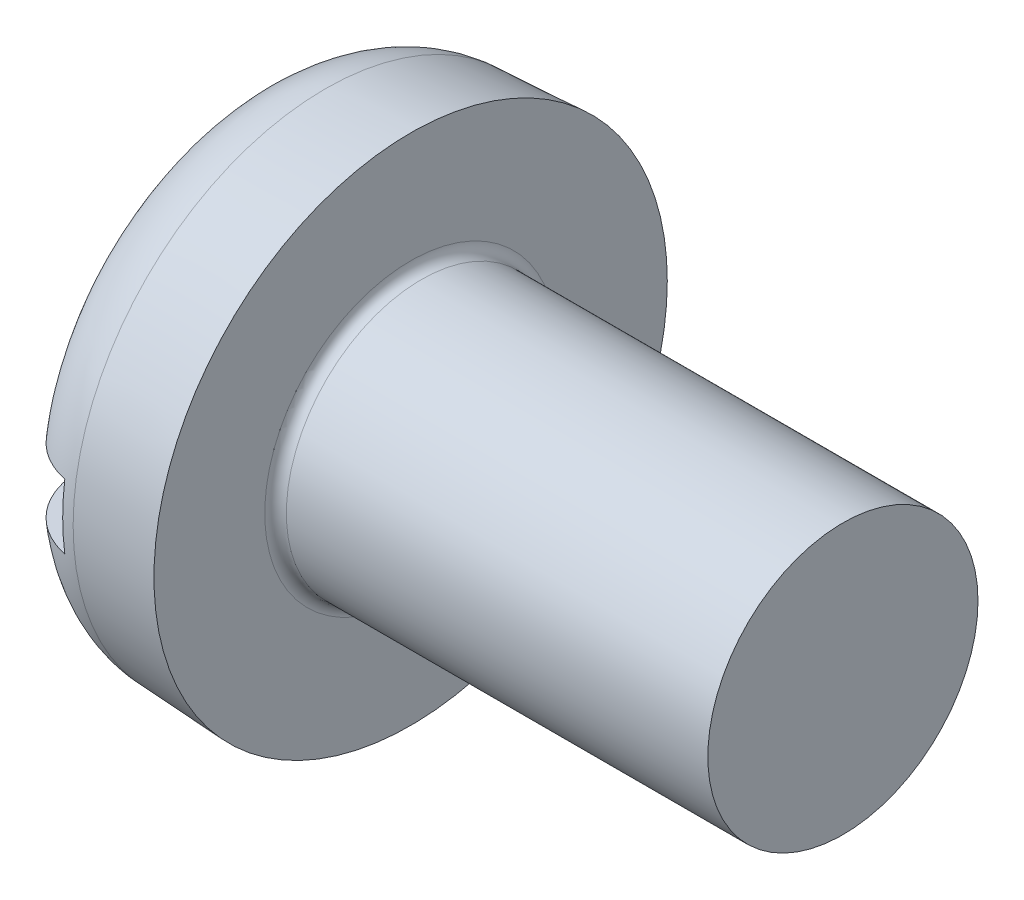
ISO-10303-21;
HEADER;
FILE_DESCRIPTION(('STEP AP214'),'2;1');
FILE_NAME('part.step','',(''),(''),'','','');
FILE_SCHEMA(('AUTOMOTIVE_DESIGN { 1 0 10303 214 1 1 1 1 }'));
ENDSEC;
DATA;
#1=APPLICATION_CONTEXT('core data for automotive mechanical design processes');
#2=APPLICATION_PROTOCOL_DEFINITION('international standard','automotive_design',2000,#1);
#3=PRODUCT_CONTEXT('',#1,'mechanical');
#4=PRODUCT('Part','Part','',(#3));
#5=PRODUCT_RELATED_PRODUCT_CATEGORY('part','',(#4));
#6=PRODUCT_DEFINITION_FORMATION('','',#4);
#7=PRODUCT_DEFINITION_CONTEXT('part definition',#1,'design');
#8=PRODUCT_DEFINITION('design','',#6,#7);
#9=PRODUCT_DEFINITION_SHAPE('','',#8);
#10=(LENGTH_UNIT() NAMED_UNIT(*) SI_UNIT(.MILLI.,.METRE.));
#11=(NAMED_UNIT(*) PLANE_ANGLE_UNIT() SI_UNIT($,.RADIAN.));
#12=(NAMED_UNIT(*) SI_UNIT($,.STERADIAN.) SOLID_ANGLE_UNIT());
#13=UNCERTAINTY_MEASURE_WITH_UNIT(LENGTH_MEASURE(1.E-05),#10,'distance_accuracy_value','');
#14=(GEOMETRIC_REPRESENTATION_CONTEXT(3) GLOBAL_UNCERTAINTY_ASSIGNED_CONTEXT((#13)) GLOBAL_UNIT_ASSIGNED_CONTEXT((#10,
#11,#12)) REPRESENTATION_CONTEXT('',''));
#15=CARTESIAN_POINT('',(0.,0.,0.));
#16=DIRECTION('',(0.,0.,1.));
#17=DIRECTION('',(1.,0.,0.));
#18=AXIS2_PLACEMENT_3D('',#15,#16,#17);
#19=CARTESIAN_POINT('',(0.,0.,0.));
#20=DIRECTION('',(1.,0.,0.));
#21=DIRECTION('',(0.,0.,-1.));
#22=AXIS2_PLACEMENT_3D('',#19,#20,#21);
#23=PLANE('',#22);
#24=CARTESIAN_POINT('',(0.,0.,0.));
#25=DIRECTION('',(1.,0.,0.));
#26=DIRECTION('',(0.,0.,-1.));
#27=AXIS2_PLACEMENT_3D('',#24,#25,#26);
#28=CIRCLE('',#27,0.792332453019639);
#29=CARTESIAN_POINT('',(0.,0.15,0.778004316252885));
#30=VERTEX_POINT('',#29);
#31=CARTESIAN_POINT('',(0.,0.15,-0.778004316252885));
#32=VERTEX_POINT('',#31);
#33=EDGE_CURVE('E100',#30,#32,#28,.F.);
#34=ORIENTED_EDGE('',*,*,#33,.T.);
#35=DIRECTION('',(0.,0.,1.));
#36=VECTOR('',#35,1.);
#37=CARTESIAN_POINT('',(0.,0.15,-1.1875));
#38=LINE('',#37,#36);
#39=EDGE_CURVE('E94',#32,#30,#38,.T.);
#40=ORIENTED_EDGE('',*,*,#39,.T.);
#41=EDGE_LOOP('',(#34,#40));
#42=FACE_BOUND('',#41,.T.);
#43=ADVANCED_FACE('F39',(#42),#23,.F.);
#44=CARTESIAN_POINT('',(0.75,0.,0.));
#45=DIRECTION('',(1.,0.,0.));
#46=DIRECTION('',(0.,0.,-1.));
#47=AXIS2_PLACEMENT_3D('',#44,#45,#46);
#48=PLANE('',#47);
#49=CARTESIAN_POINT('',(0.75,0.,0.));
#50=DIRECTION('',(1.,0.,0.));
#51=DIRECTION('',(0.,0.,-1.));
#52=AXIS2_PLACEMENT_3D('',#49,#50,#51);
#53=CIRCLE('',#52,0.675);
#54=CARTESIAN_POINT('',(0.75,0.,-0.675));
#55=VERTEX_POINT('',#54);
#56=EDGE_CURVE('E11',#55,#55,#53,.F.);
#57=ORIENTED_EDGE('',*,*,#56,.T.);
#58=EDGE_LOOP('',(#57));
#59=FACE_BOUND('',#58,.T.);
#60=CARTESIAN_POINT('',(0.75,0.,0.));
#61=DIRECTION('',(1.,0.,0.));
#62=DIRECTION('',(0.,0.,-1.));
#63=AXIS2_PLACEMENT_3D('',#60,#61,#62);
#64=CIRCLE('',#63,1.1875);
#65=CARTESIAN_POINT('',(0.75,0.,-1.1875));
#66=VERTEX_POINT('',#65);
#67=EDGE_CURVE('E171',#66,#66,#64,.T.);
#68=ORIENTED_EDGE('',*,*,#67,.T.);
#69=EDGE_LOOP('',(#68));
#70=FACE_BOUND('',#69,.T.);
#71=ADVANCED_FACE('F147',(#59,#70),#48,.T.);
#72=CARTESIAN_POINT('',(0.75,0.,0.));
#73=DIRECTION('',(1.,0.,0.));
#74=DIRECTION('',(0.,0.,-1.));
#75=AXIS2_PLACEMENT_3D('',#72,#73,#74);
#76=CONICAL_SURFACE('',#75,1.1875,0.05235987755983);
#77=CARTESIAN_POINT('',(0.355374016408896,0.,0.));
#78=DIRECTION('',(1.,0.,0.));
#79=DIRECTION('',(0.,0.,-1.));
#80=AXIS2_PLACEMENT_3D('',#77,#78,#79);
#81=CIRCLE('',#80,1.1668185285526);
#82=CARTESIAN_POINT('',(0.355374016408896,0.,-1.1668185285526));
#83=VERTEX_POINT('',#82);
#84=EDGE_CURVE('E104',#83,#83,#81,.T.);
#85=ORIENTED_EDGE('',*,*,#84,.T.);
#86=EDGE_LOOP('',(#85));
#87=FACE_BOUND('',#86,.T.);
#88=ORIENTED_EDGE('',*,*,#67,.F.);
#89=EDGE_LOOP('',(#88));
#90=FACE_BOUND('',#89,.T.);
#91=ADVANCED_FACE('F153',(#87,#90),#76,.T.);
#92=CARTESIAN_POINT('',(0.,-0.15,-0.778004316252885));
#93=VERTEX_POINT('',#92);
#94=CARTESIAN_POINT('',(0.,-0.15,0.778004316252885));
#95=VERTEX_POINT('',#94);
#96=EDGE_CURVE('E93',#93,#95,#28,.F.);
#97=ORIENTED_EDGE('',*,*,#96,.T.);
#98=DIRECTION('',(0.,0.,1.));
#99=VECTOR('',#98,1.);
#100=CARTESIAN_POINT('',(0.,-0.15,-1.1875));
#101=LINE('',#100,#99);
#102=EDGE_CURVE('E54',#93,#95,#101,.T.);
#103=ORIENTED_EDGE('',*,*,#102,.F.);
#104=EDGE_LOOP('',(#97,#103));
#105=FACE_BOUND('',#104,.T.);
#106=ADVANCED_FACE('F92',(#105),#23,.F.);
#107=CARTESIAN_POINT('',(2.75,0.,0.));
#108=DIRECTION('',(-1.,0.,0.));
#109=DIRECTION('',(0.,0.,1.));
#110=AXIS2_PLACEMENT_3D('',#107,#108,#109);
#111=CYLINDRICAL_SURFACE('',#110,0.625);
#112=CARTESIAN_POINT('',(0.8,0.,0.));
#113=DIRECTION('',(1.,0.,0.));
#114=DIRECTION('',(0.,0.,-1.));
#115=AXIS2_PLACEMENT_3D('',#112,#113,#114);
#116=CIRCLE('',#115,0.625);
#117=CARTESIAN_POINT('',(0.8,0.,-0.625));
#118=VERTEX_POINT('',#117);
#119=EDGE_CURVE('E47',#118,#118,#116,.T.);
#120=ORIENTED_EDGE('',*,*,#119,.T.);
#121=EDGE_LOOP('',(#120));
#122=FACE_BOUND('',#121,.T.);
#123=CARTESIAN_POINT('',(2.75,0.,0.));
#124=DIRECTION('',(1.,0.,0.));
#125=DIRECTION('',(0.,0.,-1.));
#126=AXIS2_PLACEMENT_3D('',#123,#124,#125);
#127=CIRCLE('',#126,0.625);
#128=CARTESIAN_POINT('',(2.75,0.,-0.625));
#129=VERTEX_POINT('',#128);
#130=EDGE_CURVE('E174',#129,#129,#127,.T.);
#131=ORIENTED_EDGE('',*,*,#130,.F.);
#132=EDGE_LOOP('',(#131));
#133=FACE_BOUND('',#132,.T.);
#134=ADVANCED_FACE('F138',(#122,#133),#111,.T.);
#135=CARTESIAN_POINT('',(2.75,0.,0.));
#136=DIRECTION('',(1.,0.,0.));
#137=DIRECTION('',(0.,0.,-1.));
#138=AXIS2_PLACEMENT_3D('',#135,#136,#137);
#139=PLANE('',#138);
#140=ORIENTED_EDGE('',*,*,#130,.T.);
#141=EDGE_LOOP('',(#140));
#142=FACE_BOUND('',#141,.T.);
#143=ADVANCED_FACE('F162',(#142),#139,.T.);
#144=CARTESIAN_POINT('',(0.375,0.,0.));
#145=DIRECTION('',(1.,0.,0.));
#146=DIRECTION('',(0.,0.,-1.));
#147=AXIS2_PLACEMENT_3D('',#144,#145,#146);
#148=TOROIDAL_SURFACE('',#147,0.792332453019639,0.375);
#149=CARTESIAN_POINT('',(0.117938396040654,0.15,-1.05474786683349));
#150=CARTESIAN_POINT('',(0.133148053996847,0.15,-1.06921091853676));
#151=CARTESIAN_POINT('',(0.149583241160335,0.15,-1.0824063576631));
#152=CARTESIAN_POINT('',(0.184447022896734,0.15,-1.10586475607808));
#153=CARTESIAN_POINT('',(0.202877818710771,0.15,-1.1161244307234));
#154=CARTESIAN_POINT('',(0.241200393773624,0.15,-1.13339576551664));
#155=CARTESIAN_POINT('',(0.261091830747331,0.15,-1.14040818380475));
#156=CARTESIAN_POINT('',(0.30176721766706,0.15,-1.15097839218264));
#157=CARTESIAN_POINT('',(0.322550955490138,0.15,-1.15453699863592));
#158=CARTESIAN_POINT('',(0.364348547254098,0.15,-1.15809155001737));
#159=CARTESIAN_POINT('',(0.385361359684495,0.15,-1.15809974596366));
#160=CARTESIAN_POINT('',(0.427089791357868,0.15,-1.15458379848556));
#161=CARTESIAN_POINT('',(0.44780540415726,0.15,-1.15105957859192));
#162=CARTESIAN_POINT('',(0.48832722611282,0.15,-1.1405882781079));
#163=CARTESIAN_POINT('',(0.508134438929328,0.15,-1.13364507973859));
#164=CARTESIAN_POINT('',(0.54630640344252,0.15,-1.11654064871918));
#165=CARTESIAN_POINT('',(0.564671150155464,0.15,-1.10637940495129));
#166=CARTESIAN_POINT('',(0.599494035129382,0.15,-1.08310196099005));
#167=CARTESIAN_POINT('',(0.615946794060781,0.15,-1.06997771544898));
#168=CARTESIAN_POINT('',(0.646433423959645,0.15,-1.0411702939484));
#169=CARTESIAN_POINT('',(0.660467241481991,0.15,-1.02548706146444));
#170=CARTESIAN_POINT('',(0.685824367711157,0.15,-0.991896253056124));
#171=CARTESIAN_POINT('',(0.697128581658448,0.15,-0.973974266825199));
#172=CARTESIAN_POINT('',(0.716605420093138,0.15,-0.936503433243874));
#173=CARTESIAN_POINT('',(0.724777901919982,0.15,-0.916954511830662));
#174=CARTESIAN_POINT('',(0.737862659478821,0.15,-0.876552435238476));
#175=CARTESIAN_POINT('',(0.742737350487743,0.15,-0.855687113474525));
#176=CARTESIAN_POINT('',(0.748972199264546,0.15,-0.813438619662805));
#177=CARTESIAN_POINT('',(0.750332105025491,0.15,-0.792055410593924));
#178=CARTESIAN_POINT('',(0.749524739968248,0.15,-0.74902408142826));
#179=CARTESIAN_POINT('',(0.747302412471675,0.15,-0.727376999079799));
#180=CARTESIAN_POINT('',(0.739319207300325,0.15,-0.684745751944764));
#181=CARTESIAN_POINT('',(0.7335579860944,0.15,-0.663761651723829));
#182=CARTESIAN_POINT('',(0.718547898483567,0.15,-0.622667260572875));
#183=CARTESIAN_POINT('',(0.709240407131013,0.15,-0.602578373181518));
#184=CARTESIAN_POINT('',(0.687416966394175,0.15,-0.564223252364528));
#185=CARTESIAN_POINT('',(0.674900568069364,0.15,-0.545957274469306));
#186=CARTESIAN_POINT('',(0.646861117850882,0.15,-0.511605451720667));
#187=CARTESIAN_POINT('',(0.63131065133905,0.15,-0.495541949308271));
#188=CARTESIAN_POINT('',(0.597686680687232,0.15,-0.466308925444178));
#189=CARTESIAN_POINT('',(0.579613177917629,0.15,-0.453139402420632));
#190=CARTESIAN_POINT('',(0.541796980732643,0.15,-0.430404625675362));
#191=CARTESIAN_POINT('',(0.522093442139136,0.15,-0.420774442989197));
#192=CARTESIAN_POINT('',(0.481283772482505,0.15,-0.405192453648094));
#193=CARTESIAN_POINT('',(0.460178442068353,0.15,-0.399238566909024));
#194=CARTESIAN_POINT('',(0.418475670494436,0.15,-0.391549135693925));
#195=CARTESIAN_POINT('',(0.397919520697724,0.15,-0.38958941039232));
#196=CARTESIAN_POINT('',(0.356785315235162,0.15,-0.38931375476261));
#197=CARTESIAN_POINT('',(0.336207265885374,0.15,-0.39099696444883));
#198=CARTESIAN_POINT('',(0.29648684420596,0.15,-0.397773503680091));
#199=CARTESIAN_POINT('',(0.277320089338094,0.15,-0.40272582128162));
#200=CARTESIAN_POINT('',(0.240046906702431,0.15,-0.415677475172748));
#201=CARTESIAN_POINT('',(0.221940680423583,0.15,-0.423677388319977));
#202=CARTESIAN_POINT('',(0.186656525842952,0.15,-0.44272792324717));
#203=CARTESIAN_POINT('',(0.169527282613075,0.15,-0.453868508172729));
#204=CARTESIAN_POINT('',(0.137242351285431,0.15,-0.478712833884035));
#205=CARTESIAN_POINT('',(0.122087148633859,0.15,-0.492417203131829));
#206=CARTESIAN_POINT('',(0.0932471955950351,0.15,-0.522893548315133));
#207=CARTESIAN_POINT('',(0.0797040820378965,0.15,-0.53979974528954));
#208=CARTESIAN_POINT('',(0.0555482167738225,0.15,-0.575591078461783));
#209=CARTESIAN_POINT('',(0.0449359730613812,0.15,-0.594476556938049));
#210=CARTESIAN_POINT('',(0.0266567196189373,0.15,-0.634309597818242));
#211=CARTESIAN_POINT('',(0.0190867192712375,0.15,-0.655301791385956));
#212=CARTESIAN_POINT('',(0.0075909661150935,0.15,-0.698261630461457));
#213=CARTESIAN_POINT('',(0.00366510170025468,0.15,-0.720229246074084));
#214=CARTESIAN_POINT('',(-0.000392095325292109,0.15,-0.764437614228241));
#215=CARTESIAN_POINT('',(-0.00053641819327254,0.15,-0.786677169077643));
#216=CARTESIAN_POINT('',(0.00297716754633172,0.15,-0.830860865549347));
#217=CARTESIAN_POINT('',(0.00663574235862702,0.15,-0.852804954728675));
#218=CARTESIAN_POINT('',(0.0175899076202847,0.15,-0.895387061361782));
#219=CARTESIAN_POINT('',(0.024825993573326,0.15,-0.916040418475777));
#220=CARTESIAN_POINT('',(0.0427176241617123,0.15,-0.955788161942995));
#221=CARTESIAN_POINT('',(0.053368638935188,0.15,-0.974884571712376));
#222=CARTESIAN_POINT('',(0.0731578765878686,0.15,-1.00412061224255));
#223=CARTESIAN_POINT('',(0.0813448220650339,0.15,-1.01491628352672));
#224=CARTESIAN_POINT('',(0.0988307551354384,0.15,-1.03556631592326));
#225=CARTESIAN_POINT('',(0.108129731514999,0.15,-1.04542068652587));
#226=CARTESIAN_POINT('',(0.117938396040654,0.15,-1.05474786683349));
#227=B_SPLINE_CURVE_WITH_KNOTS('',3,(#149,#150,#151,#152,#153,#154,#155,#156,#157,#158,#159,
#160,#161,#162,#163,#164,#165,#166,#167,#168,#169,#170,#171,#172,#173,#174,#175,#176,#177,#178,
#179,#180,#181,#182,#183,#184,#185,#186,#187,#188,#189,#190,#191,#192,#193,#194,#195,#196,#197,
#198,#199,#200,#201,#202,#203,#204,#205,#206,#207,#208,#209,#210,#211,#212,#213,#214,#215,#216,
#217,#218,#219,#220,#221,#222,#223,#224,#225,#226),.UNSPECIFIED.,.T.,.F.,(4,2,2,2,2,2,2,2,2,2,2,
2,2,2,2,2,2,2,2,2,2,2,2,2,2,2,2,2,2,2,2,2,2,2,2,2,2,2,4),(0.,0.0629162042393791,
0.125902528681037,0.188874140219022,0.25183086378475,0.314570347646819,0.377311189713791,
0.439980953796415,0.502650934394368,0.565493172309485,0.628336798509786,0.691608072741838,
0.754882228843081,0.818865887148716,0.882854132897769,0.947835249208532,1.01282267443045,
1.07893463827297,1.14505585652893,1.2118047729829,1.27855365318246,1.34400841163639,
1.40942610113053,1.47105798459848,1.53267532024833,1.59179470051753,1.65092527663728,
1.71196043936016,1.77301058332154,1.83770237367736,1.90240536974346,1.9690332106993,
2.03565901102366,2.10205590994205,2.16846444245848,2.23380379396887,2.2990568297317,
2.33963171741046,2.38020619596804),.UNSPECIFIED.);
#228=CARTESIAN_POINT('',(0.3,0.15,-1.15001468732876));
#229=VERTEX_POINT('',#228);
#230=EDGE_CURVE('E131',#32,#229,#227,.T.);
#231=ORIENTED_EDGE('',*,*,#230,.F.);
#232=ORIENTED_EDGE('',*,*,#33,.F.);
#233=CARTESIAN_POINT('',(0.164682542210043,0.15,0.457920852728973));
#234=CARTESIAN_POINT('',(0.181381671004121,0.15,0.446017761101884));
#235=CARTESIAN_POINT('',(0.199046667009262,0.15,0.435452093677302));
#236=CARTESIAN_POINT('',(0.235888781843998,0.15,0.417372323382245));
#237=CARTESIAN_POINT('',(0.255066694920986,0.15,0.409859836265062));
#238=CARTESIAN_POINT('',(0.294469994707666,0.15,0.398199959698962));
#239=CARTESIAN_POINT('',(0.314697458805752,0.15,0.394059537654149));
#240=CARTESIAN_POINT('',(0.355560326965663,0.15,0.389381805590807));
#241=CARTESIAN_POINT('',(0.376195566809646,0.15,0.388843073621121));
#242=CARTESIAN_POINT('',(0.416509358659805,0.15,0.391347701644233));
#243=CARTESIAN_POINT('',(0.43619591492007,0.15,0.394264907947967));
#244=CARTESIAN_POINT('',(0.4748090896101,0.15,0.403331754416534));
#245=CARTESIAN_POINT('',(0.493735577224442,0.15,0.409481948466241));
#246=CARTESIAN_POINT('',(0.530531855125063,0.15,0.424832978335005));
#247=CARTESIAN_POINT('',(0.548388752054901,0.15,0.434064586247067));
#248=CARTESIAN_POINT('',(0.582419517295048,0.15,0.455230749138481));
#249=CARTESIAN_POINT('',(0.598592995095634,0.15,0.467165929246209));
#250=CARTESIAN_POINT('',(0.629807015062551,0.15,0.494164963255003));
#251=CARTESIAN_POINT('',(0.644723426622674,0.15,0.509372418911942));
#252=CARTESIAN_POINT('',(0.671919132853953,0.15,0.541987009739012));
#253=CARTESIAN_POINT('',(0.68419786556609,0.15,0.559394612399466));
#254=CARTESIAN_POINT('',(0.706266266656624,0.15,0.596716203752335));
#255=CARTESIAN_POINT('',(0.715930536138396,0.15,0.616704514838335));
#256=CARTESIAN_POINT('',(0.731786804056764,0.15,0.658015158905312));
#257=CARTESIAN_POINT('',(0.737978610015505,0.15,0.679337565762107));
#258=CARTESIAN_POINT('',(0.746712496784101,0.15,0.722831956867417));
#259=CARTESIAN_POINT('',(0.749235937617185,0.15,0.745007696408818));
#260=CARTESIAN_POINT('',(0.750466055512701,0.15,0.789465669807778));
#261=CARTESIAN_POINT('',(0.749172965023442,0.15,0.811747897097108));
#262=CARTESIAN_POINT('',(0.742819845791062,0.15,0.855441774310494));
#263=CARTESIAN_POINT('',(0.737814302477183,0.15,0.876861338503665));
#264=CARTESIAN_POINT('',(0.724214028449399,0.15,0.91852954414233));
#265=CARTESIAN_POINT('',(0.715619626089416,0.15,0.938778292515864));
#266=CARTESIAN_POINT('',(0.695250071015722,0.15,0.977156019446843));
#267=CARTESIAN_POINT('',(0.683532796564843,0.15,0.9953157234864));
#268=CARTESIAN_POINT('',(0.657175575554752,0.15,1.02937365865077));
#269=CARTESIAN_POINT('',(0.642535858640045,0.15,1.04527206729939));
#270=CARTESIAN_POINT('',(0.610971520327186,0.15,1.07412575519994));
#271=CARTESIAN_POINT('',(0.594081426636055,0.15,1.08711881552133));
#272=CARTESIAN_POINT('',(0.558342969275429,0.15,1.11005363268878));
#273=CARTESIAN_POINT('',(0.53949471226592,0.15,1.11999555561195));
#274=CARTESIAN_POINT('',(0.500562712466133,0.15,1.13645448442898));
#275=CARTESIAN_POINT('',(0.480491922887225,0.15,1.14300214050575));
#276=CARTESIAN_POINT('',(0.439533335236381,0.15,1.15261661063012));
#277=CARTESIAN_POINT('',(0.41864556331099,0.15,1.15568353598022));
#278=CARTESIAN_POINT('',(0.376753779997853,0.15,1.15823960159987));
#279=CARTESIAN_POINT('',(0.355750815210586,0.15,1.15774592730527));
#280=CARTESIAN_POINT('',(0.314126775743433,0.15,1.15323607466183));
#281=CARTESIAN_POINT('',(0.293505696579433,0.15,1.14921993770068));
#282=CARTESIAN_POINT('',(0.253247746171028,0.15,1.13778800737093));
#283=CARTESIAN_POINT('',(0.233610057451144,0.15,1.1303750915307));
#284=CARTESIAN_POINT('',(0.195852861005123,0.15,1.11236713274511));
#285=CARTESIAN_POINT('',(0.177733361746233,0.15,1.1017720720538));
#286=CARTESIAN_POINT('',(0.143465031649894,0.15,1.07767076261099));
#287=CARTESIAN_POINT('',(0.127322325600387,0.15,1.0641558075995));
#288=CARTESIAN_POINT('',(0.0975157215055566,0.15,1.03462483120134));
#289=CARTESIAN_POINT('',(0.0838518880052399,0.15,1.01860874471028));
#290=CARTESIAN_POINT('',(0.0592824506810862,0.15,0.9844119681723));
#291=CARTESIAN_POINT('',(0.0483971257686497,0.15,0.966216712423493));
#292=CARTESIAN_POINT('',(0.0297964654066786,0.15,0.928273041856624));
#293=CARTESIAN_POINT('',(0.0220812891060036,0.15,0.908524549121722));
#294=CARTESIAN_POINT('',(0.00993934446056905,0.15,0.867793116353655));
#295=CARTESIAN_POINT('',(0.00555159108714,0.15,0.846798551911836));
#296=CARTESIAN_POINT('',(0.000304470300636932,0.15,0.804374639878415));
#297=CARTESIAN_POINT('',(-0.000554775824942908,0.15,0.782945277366681));
#298=CARTESIAN_POINT('',(0.00126138579818796,0.15,0.7399006419406));
#299=CARTESIAN_POINT('',(0.00399242568707709,0.15,0.718287722285946));
#300=CARTESIAN_POINT('',(0.0129817407201495,0.15,0.675802951864994));
#301=CARTESIAN_POINT('',(0.0192411625436444,0.15,0.654931344360959));
#302=CARTESIAN_POINT('',(0.0352340118563973,0.15,0.61414054218911));
#303=CARTESIAN_POINT('',(0.0450266695100048,0.15,0.594244588961838));
#304=CARTESIAN_POINT('',(0.067780233257978,0.15,0.556372046347924));
#305=CARTESIAN_POINT('',(0.0807382632219039,0.15,0.538393735732678));
#306=CARTESIAN_POINT('',(0.105358225639319,0.15,0.509659943319855));
#307=CARTESIAN_POINT('',(0.116332924369794,0.15,0.49830828797913));
#308=CARTESIAN_POINT('',(0.1395756229246,0.15,0.477014522659629));
#309=CARTESIAN_POINT('',(0.151843614657424,0.15,0.467072403862981));
#310=CARTESIAN_POINT('',(0.164682542210043,0.15,0.457920852728973));
#311=B_SPLINE_CURVE_WITH_KNOTS('',3,(#233,#234,#235,#236,#237,#238,#239,#240,#241,#242,#243,
#244,#245,#246,#247,#248,#249,#250,#251,#252,#253,#254,#255,#256,#257,#258,#259,#260,#261,#262,
#263,#264,#265,#266,#267,#268,#269,#270,#271,#272,#273,#274,#275,#276,#277,#278,#279,#280,#281,
#282,#283,#284,#285,#286,#287,#288,#289,#290,#291,#292,#293,#294,#295,#296,#297,#298,#299,#300,
#301,#302,#303,#304,#305,#306,#307,#308,#309,#310),.UNSPECIFIED.,.T.,.F.,(4,2,2,2,2,2,2,2,2,2,2,
2,2,2,2,2,2,2,2,2,2,2,2,2,2,2,2,2,2,2,2,2,2,2,2,2,2,2,4),(0.,0.061468739034389,0.12296996530696,
0.184597946093283,0.246201594648255,0.305624078569619,0.365056746243463,0.425101630496246,
0.48516041271162,0.548782130274046,0.612417389066807,0.678710829680097,0.745007944560435,
0.81164076991076,0.87826953702949,0.943939316087052,1.009603088164,1.07412560956449,
1.13864306280227,1.20226518574898,1.2658838450518,1.32891755745425,1.39194925418599,
1.45467692916303,1.51740386712197,1.58007776489046,1.64275201218056,1.70561578011263,
1.76848118465975,1.8317930759676,1.89510814529196,1.95915458833273,2.02320323286184,
2.08825611537926,2.15333015145602,2.21955002224335,2.28570994648095,2.33296975471871,
2.38022926729239),.UNSPECIFIED.);
#312=CARTESIAN_POINT('',(0.3,0.15,1.15001468732876));
#313=VERTEX_POINT('',#312);
#314=EDGE_CURVE('E88',#313,#30,#311,.T.);
#315=ORIENTED_EDGE('',*,*,#314,.F.);
#316=CARTESIAN_POINT('',(0.3,0.,0.));
#317=DIRECTION('',(1.,0.,0.));
#318=DIRECTION('',(0.,0.,-1.));
#319=AXIS2_PLACEMENT_3D('',#316,#317,#318);
#320=CIRCLE('',#319,1.15975591443712);
#321=CARTESIAN_POINT('',(0.3,-0.15,1.15001468732876));
#322=VERTEX_POINT('',#321);
#323=EDGE_CURVE('E62',#322,#313,#320,.F.);
#324=ORIENTED_EDGE('',*,*,#323,.F.);
#325=CARTESIAN_POINT('',(0.164682542210043,-0.15,0.457920852728973));
#326=CARTESIAN_POINT('',(0.146735840739521,-0.15,0.47071486725823));
#327=CARTESIAN_POINT('',(0.129879271991868,-0.15,0.485073074105098));
#328=CARTESIAN_POINT('',(0.0988010462371923,-0.15,0.516434739756006));
#329=CARTESIAN_POINT('',(0.0845842084463922,-0.15,0.533442934427147));
#330=CARTESIAN_POINT('',(0.0591966342926355,-0.15,0.569566142488697));
#331=CARTESIAN_POINT('',(0.048021810810677,-0.15,0.588678280109345));
#332=CARTESIAN_POINT('',(0.0290078696210757,-0.15,0.628485037458391));
#333=CARTESIAN_POINT('',(0.0211673409484355,-0.15,0.649178983434667));
#334=CARTESIAN_POINT('',(0.0089916865934817,-0.15,0.691793313479809));
#335=CARTESIAN_POINT('',(0.00469127747997572,-0.15,0.713723641590755));
#336=CARTESIAN_POINT('',(-0.000120364064563298,-0.15,0.757999104624926));
#337=CARTESIAN_POINT('',(-0.000631430424892763,-0.15,0.780344257685133));
#338=CARTESIAN_POINT('',(0.00216960770857789,-0.15,0.824531914449941));
#339=CARTESIAN_POINT('',(0.0054370318653411,-0.15,0.846377240221543));
#340=CARTESIAN_POINT('',(0.0156601669669705,-0.15,0.889187558065658));
#341=CARTESIAN_POINT('',(0.0226155127527771,-0.15,0.91015263707393));
#342=CARTESIAN_POINT('',(0.0398828756250034,-0.15,0.950214753993748));
#343=CARTESIAN_POINT('',(0.0501337620650234,-0.15,0.969338143495421));
#344=CARTESIAN_POINT('',(0.0737470908113873,-0.15,1.00555665144715));
#345=CARTESIAN_POINT('',(0.0871092686703024,-0.15,1.02265194209126));
#346=CARTESIAN_POINT('',(0.116347311791339,-0.15,1.05406127996376));
#347=CARTESIAN_POINT('',(0.132182692814356,-0.15,1.06841302212469));
#348=CARTESIAN_POINT('',(0.166059651280759,-0.15,1.09422080068464));
#349=CARTESIAN_POINT('',(0.18410109894451,-0.15,1.10567700730224));
#350=CARTESIAN_POINT('',(0.221676434015881,-0.15,1.12524873232841));
#351=CARTESIAN_POINT('',(0.241193050398003,-0.15,1.1333974192494));
#352=CARTESIAN_POINT('',(0.281322281879758,-0.15,1.14628085227533));
#353=CARTESIAN_POINT('',(0.301934855813904,-0.15,1.15101572651007));
#354=CARTESIAN_POINT('',(0.343542183287017,-0.15,1.15691378828829));
#355=CARTESIAN_POINT('',(0.364534019239468,-0.15,1.1580975749831));
#356=CARTESIAN_POINT('',(0.406417511062984,-0.15,1.15691723905066));
#357=CARTESIAN_POINT('',(0.427309168563695,-0.15,1.15455317433553));
#358=CARTESIAN_POINT('',(0.468361193385435,-0.15,1.14635408530331));
#359=CARTESIAN_POINT('',(0.488522784507508,-0.15,1.14052518483856));
#360=CARTESIAN_POINT('',(0.527584086110398,-0.15,1.12557210538744));
#361=CARTESIAN_POINT('',(0.546483794176216,-0.15,1.11644792009473));
#362=CARTESIAN_POINT('',(0.582530221363485,-0.15,1.09514739629116));
#363=CARTESIAN_POINT('',(0.599673171353776,-0.15,1.08296468108399));
#364=CARTESIAN_POINT('',(0.631685728025157,-0.15,1.05591019510419));
#365=CARTESIAN_POINT('',(0.646555287735155,-0.15,1.04103836878501));
#366=CARTESIAN_POINT('',(0.673700488830429,-0.15,1.00893437905899));
#367=CARTESIAN_POINT('',(0.685959726918115,-0.15,0.991688349703373));
#368=CARTESIAN_POINT('',(0.70744303766338,-0.15,0.955400327187241));
#369=CARTESIAN_POINT('',(0.716666986656876,-0.15,0.936358260893044));
#370=CARTESIAN_POINT('',(0.731926486070674,-0.15,0.896807948141573));
#371=CARTESIAN_POINT('',(0.737927656212536,-0.15,0.876286442414245));
#372=CARTESIAN_POINT('',(0.74645432252025,-0.15,0.834534456715038));
#373=CARTESIAN_POINT('',(0.748979584438759,-0.15,0.813303929059716));
#374=CARTESIAN_POINT('',(0.750526990515552,-0.15,0.77039975786883));
#375=CARTESIAN_POINT('',(0.749496471064005,-0.15,0.748724220358755));
#376=CARTESIAN_POINT('',(0.743875981198337,-0.15,0.705840107022377));
#377=CARTESIAN_POINT('',(0.73928568104624,-0.15,0.684631574641332));
#378=CARTESIAN_POINT('',(0.726586819786662,-0.15,0.642891195156586));
#379=CARTESIAN_POINT('',(0.718418425303583,-0.15,0.622377545744305));
#380=CARTESIAN_POINT('',(0.698794824598902,-0.15,0.582985591006252));
#381=CARTESIAN_POINT('',(0.687339185341233,-0.15,0.564107501563276));
#382=CARTESIAN_POINT('',(0.661297353656903,-0.15,0.528300396286437));
#383=CARTESIAN_POINT('',(0.646675419128162,-0.15,0.5113973407416));
#384=CARTESIAN_POINT('',(0.614767925093601,-0.15,0.480317820611319));
#385=CARTESIAN_POINT('',(0.597482180035834,-0.15,0.4661415461189));
#386=CARTESIAN_POINT('',(0.56094055449002,-0.15,0.441172911927611));
#387=CARTESIAN_POINT('',(0.541713004930518,-0.15,0.430339209267855));
#388=CARTESIAN_POINT('',(0.501639580426128,-0.15,0.412263343721621));
#389=CARTESIAN_POINT('',(0.480794600947502,-0.15,0.405019209702218));
#390=CARTESIAN_POINT('',(0.439267689968206,-0.15,0.394765909453456));
#391=CARTESIAN_POINT('',(0.418636580726356,-0.15,0.391551104950092));
#392=CARTESIAN_POINT('',(0.377128010273817,-0.15,0.388833710252194));
#393=CARTESIAN_POINT('',(0.356250566937444,-0.15,0.389330852347967));
#394=CARTESIAN_POINT('',(0.315930962043018,-0.15,0.39389221051592));
#395=CARTESIAN_POINT('',(0.29646848533497,-0.15,0.397781120134586));
#396=CARTESIAN_POINT('',(0.258466395809691,-0.15,0.408704411523611));
#397=CARTESIAN_POINT('',(0.239925807427202,-0.15,0.415735386014488));
#398=CARTESIAN_POINT('',(0.212033916519798,-0.15,0.428946642697559));
#399=CARTESIAN_POINT('',(0.202209075000374,-0.15,0.434154846538678));
#400=CARTESIAN_POINT('',(0.183057974377746,-0.15,0.445416463716018));
#401=CARTESIAN_POINT('',(0.173731680218183,-0.15,0.451469817515424));
#402=CARTESIAN_POINT('',(0.164682542210043,-0.15,0.457920852728973));
#403=B_SPLINE_CURVE_WITH_KNOTS('',3,(#325,#326,#327,#328,#329,#330,#331,#332,#333,#334,#335,
#336,#337,#338,#339,#340,#341,#342,#343,#344,#345,#346,#347,#348,#349,#350,#351,#352,#353,#354,
#355,#356,#357,#358,#359,#360,#361,#362,#363,#364,#365,#366,#367,#368,#369,#370,#371,#372,#373,
#374,#375,#376,#377,#378,#379,#380,#381,#382,#383,#384,#385,#386,#387,#388,#389,#390,#391,#392,
#393,#394,#395,#396,#397,#398,#399,#400,#401,#402),.UNSPECIFIED.,.T.,.F.,(4,2,2,2,2,2,2,2,2,2,2,
2,2,2,2,2,2,2,2,2,2,2,2,2,2,2,2,2,2,2,2,2,2,2,2,2,2,2,4),(0.,0.0660787410805387,
0.132276957279271,0.198385788448871,0.264466616609084,0.331188003214692,0.397912313916337,
0.463855614077429,0.529792386090565,0.594570524833751,0.659343159700649,0.723149264163108,
0.786951616811155,0.850097322815838,0.91324065866485,0.976016997379759,1.03879231139792,
1.10145700300856,1.16412181454393,1.22691837630224,1.28971623534089,1.35289777447303,
1.41608188743577,1.47992728782551,1.54377699065427,1.60857638607116,1.67338178449097,
1.73931490092998,1.80525670687549,1.87198577614926,1.93871949564491,2.00459125484678,
2.07042680181911,2.13274391383573,2.19505653151673,2.25432744329391,2.31353423661524,
2.34685499772001,2.38017341271811),.UNSPECIFIED.);
#404=EDGE_CURVE('E99',#95,#322,#403,.T.);
#405=ORIENTED_EDGE('',*,*,#404,.F.);
#406=ORIENTED_EDGE('',*,*,#96,.F.);
#407=CARTESIAN_POINT('',(0.117938396040654,-0.15,-1.05474786683349));
#408=CARTESIAN_POINT('',(0.10251413665649,-0.15,-1.04007807278435));
#409=CARTESIAN_POINT('',(0.0883275925675872,-0.15,-1.02408239530064));
#410=CARTESIAN_POINT('',(0.0628407961150956,-0.15,-0.989915129380413));
#411=CARTESIAN_POINT('',(0.0515444338771066,-0.15,-0.971740656117777));
#412=CARTESIAN_POINT('',(0.0321655189654905,-0.15,-0.933775052442303));
#413=CARTESIAN_POINT('',(0.024079658370804,-0.15,-0.913985611487117));
#414=CARTESIAN_POINT('',(0.0113106994879583,-0.15,-0.873345716946402));
#415=CARTESIAN_POINT('',(0.00662674507786209,-0.15,-0.852495531721551));
#416=CARTESIAN_POINT('',(0.000727353403706589,-0.15,-0.810091630937227));
#417=CARTESIAN_POINT('',(-0.000451836011618498,-0.15,-0.788532879075466));
#418=CARTESIAN_POINT('',(0.000761711427678657,-0.15,-0.745515813658545));
#419=CARTESIAN_POINT('',(0.00315490469617886,-0.15,-0.724057513288622));
#420=CARTESIAN_POINT('',(0.011489526474075,-0.15,-0.681460649808973));
#421=CARTESIAN_POINT('',(0.0174908647424858,-0.15,-0.660333808997021));
#422=CARTESIAN_POINT('',(0.0329013255448104,-0.15,-0.619361149281129));
#423=CARTESIAN_POINT('',(0.0423108291553606,-0.15,-0.599515473920415));
#424=CARTESIAN_POINT('',(0.0644382601420569,-0.15,-0.561358825899799));
#425=CARTESIAN_POINT('',(0.0772040079229114,-0.15,-0.543075558378968));
#426=CARTESIAN_POINT('',(0.105630595090752,-0.15,-0.508911563865623));
#427=CARTESIAN_POINT('',(0.12129181701132,-0.15,-0.493031154829792));
#428=CARTESIAN_POINT('',(0.155056943979063,-0.15,-0.46421420771001));
#429=CARTESIAN_POINT('',(0.173154414938542,-0.15,-0.451270148714224));
#430=CARTESIAN_POINT('',(0.211340875187789,-0.15,-0.428755602120732));
#431=CARTESIAN_POINT('',(0.231429229172896,-0.15,-0.41918404274773));
#432=CARTESIAN_POINT('',(0.272144452073271,-0.15,-0.404168261741806));
#433=CARTESIAN_POINT('',(0.292713679233589,-0.15,-0.398568192224009));
#434=CARTESIAN_POINT('',(0.334519674768414,-0.15,-0.391149959699401));
#435=CARTESIAN_POINT('',(0.355756087633401,-0.15,-0.389329816127061));
#436=CARTESIAN_POINT('',(0.396939140315597,-0.15,-0.389561618909977));
#437=CARTESIAN_POINT('',(0.41688740385249,-0.15,-0.391389810208442));
#438=CARTESIAN_POINT('',(0.456188696539904,-0.15,-0.398383339770076));
#439=CARTESIAN_POINT('',(0.475541685742786,-0.15,-0.403548901487686));
#440=CARTESIAN_POINT('',(0.513080680596698,-0.15,-0.416965098453251));
#441=CARTESIAN_POINT('',(0.531269728858227,-0.15,-0.425207270073456));
#442=CARTESIAN_POINT('',(0.566111234558578,-0.15,-0.444467903450097));
#443=CARTESIAN_POINT('',(0.58276333855656,-0.15,-0.455487001635298));
#444=CARTESIAN_POINT('',(0.615053269955558,-0.15,-0.480650298232373));
#445=CARTESIAN_POINT('',(0.630581224336956,-0.15,-0.494935504339218));
#446=CARTESIAN_POINT('',(0.659155707536649,-0.15,-0.525803352343906));
#447=CARTESIAN_POINT('',(0.672201667817686,-0.15,-0.542386519123494));
#448=CARTESIAN_POINT('',(0.696053856353479,-0.15,-0.578245687147779));
#449=CARTESIAN_POINT('',(0.706724401845828,-0.15,-0.597612137434748));
#450=CARTESIAN_POINT('',(0.724702076782087,-0.15,-0.637849074293995));
#451=CARTESIAN_POINT('',(0.732008932097733,-0.15,-0.658719683289377));
#452=CARTESIAN_POINT('',(0.743091412842434,-0.15,-0.701608177400564));
#453=CARTESIAN_POINT('',(0.746830280685017,-0.15,-0.723635589204805));
#454=CARTESIAN_POINT('',(0.750506042950293,-0.15,-0.768006337666012));
#455=CARTESIAN_POINT('',(0.75044312062788,-0.15,-0.790349659043517));
#456=CARTESIAN_POINT('',(0.746507542190905,-0.15,-0.834414218172985));
#457=CARTESIAN_POINT('',(0.742683070787258,-0.15,-0.856139749572588));
#458=CARTESIAN_POINT('',(0.731374572461794,-0.15,-0.898617136133964));
#459=CARTESIAN_POINT('',(0.723890881481946,-0.15,-0.919369080486205));
#460=CARTESIAN_POINT('',(0.705620845692191,-0.15,-0.958922144161988));
#461=CARTESIAN_POINT('',(0.694894795014178,-0.15,-0.977751118262609));
#462=CARTESIAN_POINT('',(0.670389274715561,-0.15,-1.01330493568076));
#463=CARTESIAN_POINT('',(0.65661004951274,-0.15,-1.03002994726025));
#464=CARTESIAN_POINT('',(0.626609700992856,-0.15,-1.06064516484574));
#465=CARTESIAN_POINT('',(0.610427164705108,-0.15,-1.07457319237287));
#466=CARTESIAN_POINT('',(0.575933540207353,-0.15,-1.09948193106185));
#467=CARTESIAN_POINT('',(0.557622571918821,-0.15,-1.11046280815869));
#468=CARTESIAN_POINT('',(0.519589031729813,-0.15,-1.12905530625871));
#469=CARTESIAN_POINT('',(0.49988226727059,-0.15,-1.13669927398508));
#470=CARTESIAN_POINT('',(0.459461752810618,-0.15,-1.14854923830715));
#471=CARTESIAN_POINT('',(0.438748079787733,-0.15,-1.1527554972781));
#472=CARTESIAN_POINT('',(0.397025566032242,-0.15,-1.15759236109886));
#473=CARTESIAN_POINT('',(0.376019029680375,-0.15,-1.15824287015677));
#474=CARTESIAN_POINT('',(0.334189957569604,-0.15,-1.15600196473784));
#475=CARTESIAN_POINT('',(0.313367467937674,-0.15,-1.15310968635428));
#476=CARTESIAN_POINT('',(0.272526658305645,-0.15,-1.14387312076356));
#477=CARTESIAN_POINT('',(0.252507574429636,-0.15,-1.13753220022536));
#478=CARTESIAN_POINT('',(0.21383330297849,-0.15,-1.12158972057156));
#479=CARTESIAN_POINT('',(0.195176445546685,-0.15,-1.11199223785071));
#480=CARTESIAN_POINT('',(0.166797700754835,-0.15,-1.09424489568329));
#481=CARTESIAN_POINT('',(0.156473915163083,-0.15,-1.08703800911311));
#482=CARTESIAN_POINT('',(0.136602117474953,-0.15,-1.07162440284745));
#483=CARTESIAN_POINT('',(0.12705410297946,-0.15,-1.06341768624419));
#484=CARTESIAN_POINT('',(0.117938396040654,-0.15,-1.05474786683349));
#485=B_SPLINE_CURVE_WITH_KNOTS('',3,(#407,#408,#409,#410,#411,#412,#413,#414,#415,#416,#417,
#418,#419,#420,#421,#422,#423,#424,#425,#426,#427,#428,#429,#430,#431,#432,#433,#434,#435,#436,
#437,#438,#439,#440,#441,#442,#443,#444,#445,#446,#447,#448,#449,#450,#451,#452,#453,#454,#455,
#456,#457,#458,#459,#460,#461,#462,#463,#464,#465,#466,#467,#468,#469,#470,#471,#472,#473,#474,
#475,#476,#477,#478,#479,#480,#481,#482,#483,#484),.UNSPECIFIED.,.T.,.F.,(4,2,2,2,2,2,2,2,2,2,2,
2,2,2,2,2,2,2,2,2,2,2,2,2,2,2,2,2,2,2,2,2,2,2,2,2,2,2,4),(0.,0.0638125525043915,
0.127710548830076,0.191542536322438,0.255358454318683,0.319832127387536,0.384314038431008,
0.449897376014268,0.51548804892144,0.582069328957705,0.648659411628077,0.715076960514774,
0.781473382926216,0.845093457424005,0.908680188530235,0.968486823300178,1.0282974628528,
1.08794476405744,1.14760574795602,1.21062538175479,1.27365943379268,1.33968507625555,
1.40571609861104,1.47242025767716,1.53912120145435,1.6049787018906,1.67083015728225,
1.73552541057811,1.80021548665237,1.86396112998382,1.9277031834569,1.99081282896034,
2.05391765731458,2.1166688759129,2.17943539940676,2.24214075801772,2.30476791312804,
2.34248112270021,2.38019421563771),.UNSPECIFIED.);
#486=CARTESIAN_POINT('',(0.3,-0.15,-1.15001468732876));
#487=VERTEX_POINT('',#486);
#488=EDGE_CURVE('E81',#487,#93,#485,.T.);
#489=ORIENTED_EDGE('',*,*,#488,.F.);
#490=EDGE_CURVE('E87',#229,#487,#320,.F.);
#491=ORIENTED_EDGE('',*,*,#490,.F.);
#492=EDGE_LOOP('',(#231,#232,#315,#324,#405,#406,#489,#491));
#493=FACE_BOUND('',#492,.T.);
#494=ORIENTED_EDGE('',*,*,#84,.F.);
#495=EDGE_LOOP('',(#494));
#496=FACE_BOUND('',#495,.T.);
#497=ADVANCED_FACE('F97',(#493,#496),#148,.T.);
#498=CARTESIAN_POINT('',(0.3,0.15,-1.1875));
#499=DIRECTION('',(0.,1.,0.));
#500=DIRECTION('',(0.,0.,1.));
#501=AXIS2_PLACEMENT_3D('',#498,#499,#500);
#502=PLANE('',#501);
#503=ORIENTED_EDGE('',*,*,#230,.T.);
#504=DIRECTION('',(0.,0.,1.));
#505=VECTOR('',#504,1.);
#506=CARTESIAN_POINT('',(0.3,0.15,-1.1875));
#507=LINE('',#506,#505);
#508=EDGE_CURVE('E178',#229,#313,#507,.T.);
#509=ORIENTED_EDGE('',*,*,#508,.T.);
#510=ORIENTED_EDGE('',*,*,#314,.T.);
#511=ORIENTED_EDGE('',*,*,#39,.F.);
#512=EDGE_LOOP('',(#503,#509,#510,#511));
#513=FACE_BOUND('',#512,.T.);
#514=ADVANCED_FACE('F120',(#513),#502,.F.);
#515=CARTESIAN_POINT('',(0.3,0.15,-1.1875));
#516=DIRECTION('',(1.,0.,0.));
#517=DIRECTION('',(0.,0.,-1.));
#518=AXIS2_PLACEMENT_3D('',#515,#516,#517);
#519=PLANE('',#518);
#520=ORIENTED_EDGE('',*,*,#323,.T.);
#521=ORIENTED_EDGE('',*,*,#508,.F.);
#522=ORIENTED_EDGE('',*,*,#490,.T.);
#523=DIRECTION('',(0.,0.,1.));
#524=VECTOR('',#523,1.);
#525=CARTESIAN_POINT('',(0.3,-0.15,-1.1875));
#526=LINE('',#525,#524);
#527=EDGE_CURVE('E83',#487,#322,#526,.T.);
#528=ORIENTED_EDGE('',*,*,#527,.T.);
#529=EDGE_LOOP('',(#520,#521,#522,#528));
#530=FACE_BOUND('',#529,.T.);
#531=ADVANCED_FACE('F119',(#530),#519,.F.);
#532=CARTESIAN_POINT('',(0.3,-0.15,-1.1875));
#533=DIRECTION('',(0.,-1.,0.));
#534=DIRECTION('',(1.,0.,0.));
#535=AXIS2_PLACEMENT_3D('',#532,#533,#534);
#536=PLANE('',#535);
#537=ORIENTED_EDGE('',*,*,#488,.T.);
#538=ORIENTED_EDGE('',*,*,#102,.T.);
#539=ORIENTED_EDGE('',*,*,#404,.T.);
#540=ORIENTED_EDGE('',*,*,#527,.F.);
#541=EDGE_LOOP('',(#537,#538,#539,#540));
#542=FACE_BOUND('',#541,.T.);
#543=ADVANCED_FACE('F82',(#542),#536,.F.);
#544=CARTESIAN_POINT('',(0.8,0.,0.));
#545=DIRECTION('',(1.,0.,0.));
#546=DIRECTION('',(0.,0.,-1.));
#547=AXIS2_PLACEMENT_3D('',#544,#545,#546);
#548=TOROIDAL_SURFACE('',#547,0.675,0.05);
#549=ORIENTED_EDGE('',*,*,#56,.F.);
#550=EDGE_LOOP('',(#549));
#551=FACE_BOUND('',#550,.T.);
#552=ORIENTED_EDGE('',*,*,#119,.F.);
#553=EDGE_LOOP('',(#552));
#554=FACE_BOUND('',#553,.T.);
#555=ADVANCED_FACE('F41',(#551,#554),#548,.F.);
#556=CLOSED_SHELL('',(#43,#71,#91,#106,#134,#143,#497,#514,#531,#543,#555));
#557=MANIFOLD_SOLID_BREP('B2',#556);
#558=ADVANCED_BREP_SHAPE_REPRESENTATION('',(#18,#557),#14);
#559=SHAPE_DEFINITION_REPRESENTATION(#9,#558);
ENDSEC;
END-ISO-10303-21;
